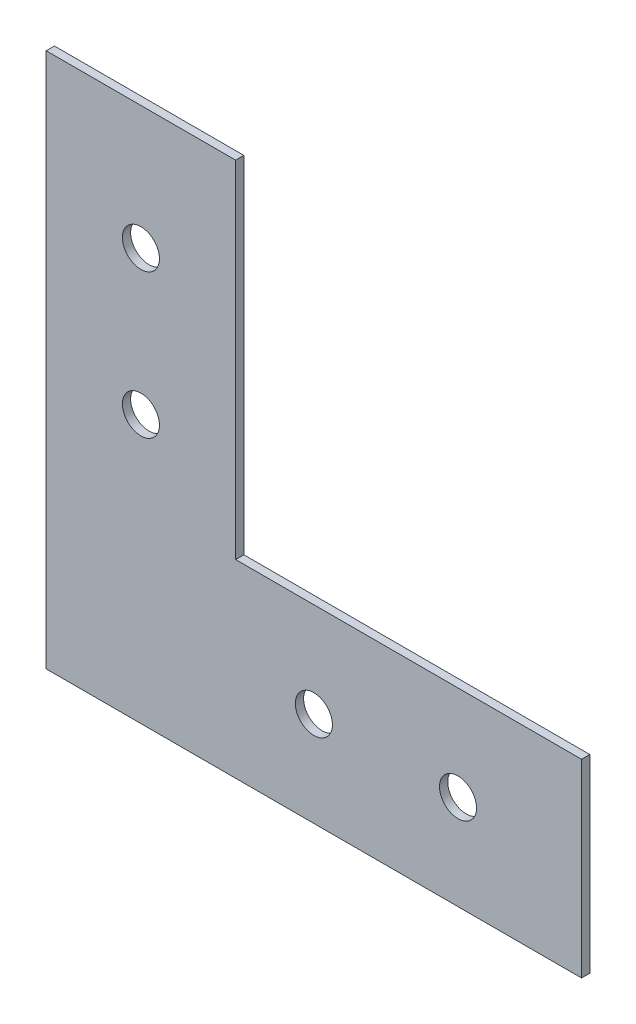
ISO-10303-21;
HEADER;
FILE_DESCRIPTION(('STEP AP214'),'2;1');
FILE_NAME('part.step','',(''),(''),'','','');
FILE_SCHEMA(('AUTOMOTIVE_DESIGN { 1 0 10303 214 1 1 1 1 }'));
ENDSEC;
DATA;
#1=APPLICATION_CONTEXT('core data for automotive mechanical design processes');
#2=APPLICATION_PROTOCOL_DEFINITION('international standard','automotive_design',2000,#1);
#3=PRODUCT_CONTEXT('',#1,'mechanical');
#4=PRODUCT('Part','Part','',(#3));
#5=PRODUCT_RELATED_PRODUCT_CATEGORY('part','',(#4));
#6=PRODUCT_DEFINITION_FORMATION('','',#4);
#7=PRODUCT_DEFINITION_CONTEXT('part definition',#1,'design');
#8=PRODUCT_DEFINITION('design','',#6,#7);
#9=PRODUCT_DEFINITION_SHAPE('','',#8);
#10=(LENGTH_UNIT() NAMED_UNIT(*) SI_UNIT(.MILLI.,.METRE.));
#11=(NAMED_UNIT(*) PLANE_ANGLE_UNIT() SI_UNIT($,.RADIAN.));
#12=(NAMED_UNIT(*) SI_UNIT($,.STERADIAN.) SOLID_ANGLE_UNIT());
#13=UNCERTAINTY_MEASURE_WITH_UNIT(LENGTH_MEASURE(1.E-05),#10,'distance_accuracy_value','');
#14=(GEOMETRIC_REPRESENTATION_CONTEXT(3) GLOBAL_UNCERTAINTY_ASSIGNED_CONTEXT((#13)) GLOBAL_UNIT_ASSIGNED_CONTEXT((#10,
#11,#12)) REPRESENTATION_CONTEXT('',''));
#15=CARTESIAN_POINT('',(0.,0.,0.));
#16=DIRECTION('',(0.,0.,1.));
#17=DIRECTION('',(1.,0.,0.));
#18=AXIS2_PLACEMENT_3D('',#15,#16,#17);
#19=CARTESIAN_POINT('',(0.,0.,2.));
#20=DIRECTION('',(0.,0.,1.));
#21=DIRECTION('',(1.,0.,0.));
#22=AXIS2_PLACEMENT_3D('',#19,#20,#21);
#23=PLANE('',#22);
#24=CARTESIAN_POINT('',(65.,23.,2.));
#25=DIRECTION('',(0.,0.,1.));
#26=DIRECTION('',(1.,0.,0.));
#27=AXIS2_PLACEMENT_3D('',#24,#25,#26);
#28=CIRCLE('',#27,4.5);
#29=CARTESIAN_POINT('',(69.5,23.,2.));
#30=VERTEX_POINT('',#29);
#31=EDGE_CURVE('E194',#30,#30,#28,.T.);
#32=ORIENTED_EDGE('',*,*,#31,.F.);
#33=EDGE_LOOP('',(#32));
#34=FACE_BOUND('',#33,.T.);
#35=CARTESIAN_POINT('',(23.,100.,2.));
#36=DIRECTION('',(0.,0.,1.));
#37=DIRECTION('',(1.,0.,0.));
#38=AXIS2_PLACEMENT_3D('',#35,#36,#37);
#39=CIRCLE('',#38,4.5);
#40=CARTESIAN_POINT('',(27.5,100.,2.));
#41=VERTEX_POINT('',#40);
#42=EDGE_CURVE('E126',#41,#41,#39,.T.);
#43=ORIENTED_EDGE('',*,*,#42,.F.);
#44=EDGE_LOOP('',(#43));
#45=FACE_BOUND('',#44,.T.);
#46=DIRECTION('',(-1.,0.,0.));
#47=VECTOR('',#46,1.);
#48=CARTESIAN_POINT('',(46.,130.,2.));
#49=LINE('',#48,#47);
#50=CARTESIAN_POINT('',(46.,130.,2.));
#51=VERTEX_POINT('',#50);
#52=CARTESIAN_POINT('',(0.,130.,2.));
#53=VERTEX_POINT('',#52);
#54=EDGE_CURVE('E133',#51,#53,#49,.T.);
#55=ORIENTED_EDGE('',*,*,#54,.T.);
#56=DIRECTION('',(0.,-1.,0.));
#57=VECTOR('',#56,1.);
#58=CARTESIAN_POINT('',(0.,130.,2.));
#59=LINE('',#58,#57);
#60=CARTESIAN_POINT('',(0.,0.,2.));
#61=VERTEX_POINT('',#60);
#62=EDGE_CURVE('E91',#53,#61,#59,.T.);
#63=ORIENTED_EDGE('',*,*,#62,.T.);
#64=DIRECTION('',(1.,0.,0.));
#65=VECTOR('',#64,1.);
#66=CARTESIAN_POINT('',(0.,0.,2.));
#67=LINE('',#66,#65);
#68=CARTESIAN_POINT('',(130.,0.,2.));
#69=VERTEX_POINT('',#68);
#70=EDGE_CURVE('E104',#61,#69,#67,.T.);
#71=ORIENTED_EDGE('',*,*,#70,.T.);
#72=DIRECTION('',(0.,1.,0.));
#73=VECTOR('',#72,1.);
#74=CARTESIAN_POINT('',(130.,46.,2.));
#75=LINE('',#74,#73);
#76=CARTESIAN_POINT('',(130.,46.,2.));
#77=VERTEX_POINT('',#76);
#78=EDGE_CURVE('E98',#69,#77,#75,.T.);
#79=ORIENTED_EDGE('',*,*,#78,.T.);
#80=DIRECTION('',(-1.,0.,0.));
#81=VECTOR('',#80,1.);
#82=CARTESIAN_POINT('',(46.,46.,2.));
#83=LINE('',#82,#81);
#84=CARTESIAN_POINT('',(46.,46.,2.));
#85=VERTEX_POINT('',#84);
#86=EDGE_CURVE('E102',#77,#85,#83,.T.);
#87=ORIENTED_EDGE('',*,*,#86,.T.);
#88=DIRECTION('',(0.,1.,0.));
#89=VECTOR('',#88,1.);
#90=CARTESIAN_POINT('',(46.,130.,2.));
#91=LINE('',#90,#89);
#92=EDGE_CURVE('E54',#85,#51,#91,.T.);
#93=ORIENTED_EDGE('',*,*,#92,.T.);
#94=EDGE_LOOP('',(#55,#63,#71,#79,#87,#93));
#95=FACE_BOUND('',#94,.T.);
#96=CARTESIAN_POINT('',(23.,65.,2.));
#97=DIRECTION('',(0.,0.,1.));
#98=DIRECTION('',(1.,0.,0.));
#99=AXIS2_PLACEMENT_3D('',#96,#97,#98);
#100=CIRCLE('',#99,4.5);
#101=CARTESIAN_POINT('',(27.5,65.,2.));
#102=VERTEX_POINT('',#101);
#103=EDGE_CURVE('E200',#102,#102,#100,.T.);
#104=ORIENTED_EDGE('',*,*,#103,.F.);
#105=EDGE_LOOP('',(#104));
#106=FACE_BOUND('',#105,.T.);
#107=CARTESIAN_POINT('',(100.,23.,2.));
#108=DIRECTION('',(0.,0.,1.));
#109=DIRECTION('',(1.,0.,0.));
#110=AXIS2_PLACEMENT_3D('',#107,#108,#109);
#111=CIRCLE('',#110,4.5);
#112=CARTESIAN_POINT('',(104.5,23.,2.));
#113=VERTEX_POINT('',#112);
#114=EDGE_CURVE('E185',#113,#113,#111,.T.);
#115=ORIENTED_EDGE('',*,*,#114,.F.);
#116=EDGE_LOOP('',(#115));
#117=FACE_BOUND('',#116,.T.);
#118=ADVANCED_FACE('F37',(#34,#45,#95,#106,#117),#23,.T.);
#119=CARTESIAN_POINT('',(0.,0.,0.));
#120=DIRECTION('',(0.,0.,1.));
#121=DIRECTION('',(1.,0.,0.));
#122=AXIS2_PLACEMENT_3D('',#119,#120,#121);
#123=PLANE('',#122);
#124=CARTESIAN_POINT('',(65.,23.,0.));
#125=DIRECTION('',(0.,0.,1.));
#126=DIRECTION('',(1.,0.,0.));
#127=AXIS2_PLACEMENT_3D('',#124,#125,#126);
#128=CIRCLE('',#127,4.5);
#129=CARTESIAN_POINT('',(69.5,23.,0.));
#130=VERTEX_POINT('',#129);
#131=EDGE_CURVE('E191',#130,#130,#128,.T.);
#132=ORIENTED_EDGE('',*,*,#131,.T.);
#133=EDGE_LOOP('',(#132));
#134=FACE_BOUND('',#133,.T.);
#135=CARTESIAN_POINT('',(23.,100.,0.));
#136=DIRECTION('',(0.,0.,1.));
#137=DIRECTION('',(1.,0.,0.));
#138=AXIS2_PLACEMENT_3D('',#135,#136,#137);
#139=CIRCLE('',#138,4.5);
#140=CARTESIAN_POINT('',(27.5,100.,0.));
#141=VERTEX_POINT('',#140);
#142=EDGE_CURVE('E203',#141,#141,#139,.T.);
#143=ORIENTED_EDGE('',*,*,#142,.T.);
#144=EDGE_LOOP('',(#143));
#145=FACE_BOUND('',#144,.T.);
#146=DIRECTION('',(-1.,0.,0.));
#147=VECTOR('',#146,1.);
#148=CARTESIAN_POINT('',(46.,130.,0.));
#149=LINE('',#148,#147);
#150=CARTESIAN_POINT('',(46.,130.,0.));
#151=VERTEX_POINT('',#150);
#152=CARTESIAN_POINT('',(0.,130.,0.));
#153=VERTEX_POINT('',#152);
#154=EDGE_CURVE('E122',#151,#153,#149,.T.);
#155=ORIENTED_EDGE('',*,*,#154,.F.);
#156=DIRECTION('',(0.,1.,0.));
#157=VECTOR('',#156,1.);
#158=CARTESIAN_POINT('',(46.,130.,0.));
#159=LINE('',#158,#157);
#160=CARTESIAN_POINT('',(46.,46.,0.));
#161=VERTEX_POINT('',#160);
#162=EDGE_CURVE('E83',#161,#151,#159,.T.);
#163=ORIENTED_EDGE('',*,*,#162,.F.);
#164=DIRECTION('',(-1.,0.,0.));
#165=VECTOR('',#164,1.);
#166=CARTESIAN_POINT('',(46.,46.,0.));
#167=LINE('',#166,#165);
#168=CARTESIAN_POINT('',(130.,46.,0.));
#169=VERTEX_POINT('',#168);
#170=EDGE_CURVE('E77',#169,#161,#167,.T.);
#171=ORIENTED_EDGE('',*,*,#170,.F.);
#172=DIRECTION('',(0.,1.,0.));
#173=VECTOR('',#172,1.);
#174=CARTESIAN_POINT('',(130.,46.,0.));
#175=LINE('',#174,#173);
#176=CARTESIAN_POINT('',(130.,0.,0.));
#177=VERTEX_POINT('',#176);
#178=EDGE_CURVE('E112',#177,#169,#175,.T.);
#179=ORIENTED_EDGE('',*,*,#178,.F.);
#180=DIRECTION('',(1.,0.,0.));
#181=VECTOR('',#180,1.);
#182=CARTESIAN_POINT('',(0.,0.,0.));
#183=LINE('',#182,#181);
#184=CARTESIAN_POINT('',(0.,0.,0.));
#185=VERTEX_POINT('',#184);
#186=EDGE_CURVE('E128',#185,#177,#183,.T.);
#187=ORIENTED_EDGE('',*,*,#186,.F.);
#188=DIRECTION('',(0.,-1.,0.));
#189=VECTOR('',#188,1.);
#190=CARTESIAN_POINT('',(0.,130.,0.));
#191=LINE('',#190,#189);
#192=EDGE_CURVE('E125',#153,#185,#191,.T.);
#193=ORIENTED_EDGE('',*,*,#192,.F.);
#194=EDGE_LOOP('',(#155,#163,#171,#179,#187,#193));
#195=FACE_BOUND('',#194,.T.);
#196=CARTESIAN_POINT('',(23.,65.,0.));
#197=DIRECTION('',(0.,0.,1.));
#198=DIRECTION('',(1.,0.,0.));
#199=AXIS2_PLACEMENT_3D('',#196,#197,#198);
#200=CIRCLE('',#199,4.5);
#201=CARTESIAN_POINT('',(27.5,65.,0.));
#202=VERTEX_POINT('',#201);
#203=EDGE_CURVE('E197',#202,#202,#200,.T.);
#204=ORIENTED_EDGE('',*,*,#203,.T.);
#205=EDGE_LOOP('',(#204));
#206=FACE_BOUND('',#205,.T.);
#207=CARTESIAN_POINT('',(100.,23.,0.));
#208=DIRECTION('',(0.,0.,1.));
#209=DIRECTION('',(1.,0.,0.));
#210=AXIS2_PLACEMENT_3D('',#207,#208,#209);
#211=CIRCLE('',#210,4.5);
#212=CARTESIAN_POINT('',(104.5,23.,0.));
#213=VERTEX_POINT('',#212);
#214=EDGE_CURVE('E188',#213,#213,#211,.T.);
#215=ORIENTED_EDGE('',*,*,#214,.T.);
#216=EDGE_LOOP('',(#215));
#217=FACE_BOUND('',#216,.T.);
#218=ADVANCED_FACE('F142',(#134,#145,#195,#206,#217),#123,.F.);
#219=CARTESIAN_POINT('',(46.,130.,2.));
#220=DIRECTION('',(0.,-1.,0.));
#221=DIRECTION('',(0.,0.,-1.));
#222=AXIS2_PLACEMENT_3D('',#219,#220,#221);
#223=PLANE('',#222);
#224=ORIENTED_EDGE('',*,*,#154,.T.);
#225=DIRECTION('',(0.,0.,-1.));
#226=VECTOR('',#225,1.);
#227=CARTESIAN_POINT('',(0.,130.,2.));
#228=LINE('',#227,#226);
#229=EDGE_CURVE('E11',#53,#153,#228,.T.);
#230=ORIENTED_EDGE('',*,*,#229,.F.);
#231=ORIENTED_EDGE('',*,*,#54,.F.);
#232=DIRECTION('',(0.,0.,-1.));
#233=VECTOR('',#232,1.);
#234=CARTESIAN_POINT('',(46.,130.,2.));
#235=LINE('',#234,#233);
#236=EDGE_CURVE('E118',#51,#151,#235,.T.);
#237=ORIENTED_EDGE('',*,*,#236,.T.);
#238=EDGE_LOOP('',(#224,#230,#231,#237));
#239=FACE_BOUND('',#238,.T.);
#240=ADVANCED_FACE('F39',(#239),#223,.F.);
#241=CARTESIAN_POINT('',(0.,130.,2.));
#242=DIRECTION('',(1.,0.,0.));
#243=DIRECTION('',(0.,0.,-1.));
#244=AXIS2_PLACEMENT_3D('',#241,#242,#243);
#245=PLANE('',#244);
#246=ORIENTED_EDGE('',*,*,#192,.T.);
#247=DIRECTION('',(0.,0.,-1.));
#248=VECTOR('',#247,1.);
#249=CARTESIAN_POINT('',(0.,0.,2.));
#250=LINE('',#249,#248);
#251=EDGE_CURVE('E46',#61,#185,#250,.T.);
#252=ORIENTED_EDGE('',*,*,#251,.F.);
#253=ORIENTED_EDGE('',*,*,#62,.F.);
#254=ORIENTED_EDGE('',*,*,#229,.T.);
#255=EDGE_LOOP('',(#246,#252,#253,#254));
#256=FACE_BOUND('',#255,.T.);
#257=ADVANCED_FACE('F260',(#256),#245,.F.);
#258=CARTESIAN_POINT('',(0.,0.,2.));
#259=DIRECTION('',(0.,1.,0.));
#260=DIRECTION('',(0.,0.,1.));
#261=AXIS2_PLACEMENT_3D('',#258,#259,#260);
#262=PLANE('',#261);
#263=ORIENTED_EDGE('',*,*,#186,.T.);
#264=DIRECTION('',(0.,0.,-1.));
#265=VECTOR('',#264,1.);
#266=CARTESIAN_POINT('',(130.,0.,2.));
#267=LINE('',#266,#265);
#268=EDGE_CURVE('E113',#69,#177,#267,.T.);
#269=ORIENTED_EDGE('',*,*,#268,.F.);
#270=ORIENTED_EDGE('',*,*,#70,.F.);
#271=ORIENTED_EDGE('',*,*,#251,.T.);
#272=EDGE_LOOP('',(#263,#269,#270,#271));
#273=FACE_BOUND('',#272,.T.);
#274=ADVANCED_FACE('F139',(#273),#262,.F.);
#275=CARTESIAN_POINT('',(130.,46.,2.));
#276=DIRECTION('',(-1.,0.,0.));
#277=DIRECTION('',(0.,0.,1.));
#278=AXIS2_PLACEMENT_3D('',#275,#276,#277);
#279=PLANE('',#278);
#280=ORIENTED_EDGE('',*,*,#178,.T.);
#281=DIRECTION('',(0.,0.,-1.));
#282=VECTOR('',#281,1.);
#283=CARTESIAN_POINT('',(130.,46.,2.));
#284=LINE('',#283,#282);
#285=EDGE_CURVE('E109',#77,#169,#284,.T.);
#286=ORIENTED_EDGE('',*,*,#285,.F.);
#287=ORIENTED_EDGE('',*,*,#78,.F.);
#288=ORIENTED_EDGE('',*,*,#268,.T.);
#289=EDGE_LOOP('',(#280,#286,#287,#288));
#290=FACE_BOUND('',#289,.T.);
#291=ADVANCED_FACE('F110',(#290),#279,.F.);
#292=CARTESIAN_POINT('',(46.,46.,2.));
#293=DIRECTION('',(0.,-1.,0.));
#294=DIRECTION('',(0.,0.,-1.));
#295=AXIS2_PLACEMENT_3D('',#292,#293,#294);
#296=PLANE('',#295);
#297=ORIENTED_EDGE('',*,*,#170,.T.);
#298=DIRECTION('',(0.,0.,-1.));
#299=VECTOR('',#298,1.);
#300=CARTESIAN_POINT('',(46.,46.,2.));
#301=LINE('',#300,#299);
#302=EDGE_CURVE('E114',#85,#161,#301,.T.);
#303=ORIENTED_EDGE('',*,*,#302,.F.);
#304=ORIENTED_EDGE('',*,*,#86,.F.);
#305=ORIENTED_EDGE('',*,*,#285,.T.);
#306=EDGE_LOOP('',(#297,#303,#304,#305));
#307=FACE_BOUND('',#306,.T.);
#308=ADVANCED_FACE('F116',(#307),#296,.F.);
#309=CARTESIAN_POINT('',(46.,130.,2.));
#310=DIRECTION('',(-1.,0.,0.));
#311=DIRECTION('',(0.,0.,1.));
#312=AXIS2_PLACEMENT_3D('',#309,#310,#311);
#313=PLANE('',#312);
#314=ORIENTED_EDGE('',*,*,#162,.T.);
#315=ORIENTED_EDGE('',*,*,#236,.F.);
#316=ORIENTED_EDGE('',*,*,#92,.F.);
#317=ORIENTED_EDGE('',*,*,#302,.T.);
#318=EDGE_LOOP('',(#314,#315,#316,#317));
#319=FACE_BOUND('',#318,.T.);
#320=ADVANCED_FACE('F147',(#319),#313,.F.);
#321=CARTESIAN_POINT('',(23.,100.,2.));
#322=DIRECTION('',(0.,0.,-1.));
#323=DIRECTION('',(-1.,0.,0.));
#324=AXIS2_PLACEMENT_3D('',#321,#322,#323);
#325=CYLINDRICAL_SURFACE('',#324,4.5);
#326=ORIENTED_EDGE('',*,*,#42,.T.);
#327=EDGE_LOOP('',(#326));
#328=FACE_BOUND('',#327,.T.);
#329=ORIENTED_EDGE('',*,*,#142,.F.);
#330=EDGE_LOOP('',(#329));
#331=FACE_BOUND('',#330,.T.);
#332=ADVANCED_FACE('F149',(#328,#331),#325,.F.);
#333=CARTESIAN_POINT('',(23.,65.,2.));
#334=DIRECTION('',(0.,0.,-1.));
#335=DIRECTION('',(-1.,0.,0.));
#336=AXIS2_PLACEMENT_3D('',#333,#334,#335);
#337=CYLINDRICAL_SURFACE('',#336,4.5);
#338=ORIENTED_EDGE('',*,*,#103,.T.);
#339=EDGE_LOOP('',(#338));
#340=FACE_BOUND('',#339,.T.);
#341=ORIENTED_EDGE('',*,*,#203,.F.);
#342=EDGE_LOOP('',(#341));
#343=FACE_BOUND('',#342,.T.);
#344=ADVANCED_FACE('F155',(#340,#343),#337,.F.);
#345=CARTESIAN_POINT('',(65.,23.,2.));
#346=DIRECTION('',(0.,0.,-1.));
#347=DIRECTION('',(-1.,0.,0.));
#348=AXIS2_PLACEMENT_3D('',#345,#346,#347);
#349=CYLINDRICAL_SURFACE('',#348,4.5);
#350=ORIENTED_EDGE('',*,*,#31,.T.);
#351=EDGE_LOOP('',(#350));
#352=FACE_BOUND('',#351,.T.);
#353=ORIENTED_EDGE('',*,*,#131,.F.);
#354=EDGE_LOOP('',(#353));
#355=FACE_BOUND('',#354,.T.);
#356=ADVANCED_FACE('F172',(#352,#355),#349,.F.);
#357=CARTESIAN_POINT('',(100.,23.,2.));
#358=DIRECTION('',(0.,0.,-1.));
#359=DIRECTION('',(-1.,0.,0.));
#360=AXIS2_PLACEMENT_3D('',#357,#358,#359);
#361=CYLINDRICAL_SURFACE('',#360,4.5);
#362=ORIENTED_EDGE('',*,*,#114,.T.);
#363=EDGE_LOOP('',(#362));
#364=FACE_BOUND('',#363,.T.);
#365=ORIENTED_EDGE('',*,*,#214,.F.);
#366=EDGE_LOOP('',(#365));
#367=FACE_BOUND('',#366,.T.);
#368=ADVANCED_FACE('F176',(#364,#367),#361,.F.);
#369=CLOSED_SHELL('',(#118,#218,#240,#257,#274,#291,#308,#320,#332,#344,#356,#368));
#370=MANIFOLD_SOLID_BREP('B2',#369);
#371=ADVANCED_BREP_SHAPE_REPRESENTATION('',(#18,#370),#14);
#372=SHAPE_DEFINITION_REPRESENTATION(#9,#371);
ENDSEC;
END-ISO-10303-21;
